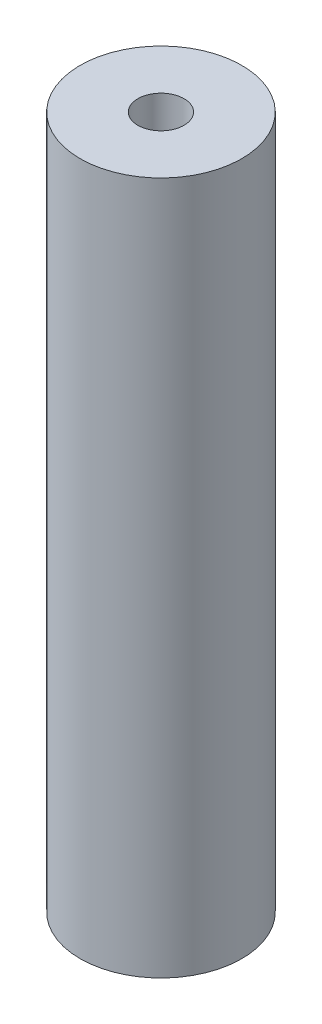
ISO-10303-21;
HEADER;
FILE_DESCRIPTION(('STEP AP214'),'2;1');
FILE_NAME('part.step','',(''),(''),'','','');
FILE_SCHEMA(('AUTOMOTIVE_DESIGN { 1 0 10303 214 1 1 1 1 }'));
ENDSEC;
DATA;
#1=APPLICATION_CONTEXT('core data for automotive mechanical design processes');
#2=APPLICATION_PROTOCOL_DEFINITION('international standard','automotive_design',2000,#1);
#3=PRODUCT_CONTEXT('',#1,'mechanical');
#4=PRODUCT('Part','Part','',(#3));
#5=PRODUCT_RELATED_PRODUCT_CATEGORY('part','',(#4));
#6=PRODUCT_DEFINITION_FORMATION('','',#4);
#7=PRODUCT_DEFINITION_CONTEXT('part definition',#1,'design');
#8=PRODUCT_DEFINITION('design','',#6,#7);
#9=PRODUCT_DEFINITION_SHAPE('','',#8);
#10=(LENGTH_UNIT() NAMED_UNIT(*) SI_UNIT(.MILLI.,.METRE.));
#11=(NAMED_UNIT(*) PLANE_ANGLE_UNIT() SI_UNIT($,.RADIAN.));
#12=(NAMED_UNIT(*) SI_UNIT($,.STERADIAN.) SOLID_ANGLE_UNIT());
#13=UNCERTAINTY_MEASURE_WITH_UNIT(LENGTH_MEASURE(1.E-05),#10,'distance_accuracy_value','');
#14=(GEOMETRIC_REPRESENTATION_CONTEXT(3) GLOBAL_UNCERTAINTY_ASSIGNED_CONTEXT((#13)) GLOBAL_UNIT_ASSIGNED_CONTEXT((#10,
#11,#12)) REPRESENTATION_CONTEXT('',''));
#15=CARTESIAN_POINT('',(0.,0.,0.));
#16=DIRECTION('',(0.,0.,1.));
#17=DIRECTION('',(1.,0.,0.));
#18=AXIS2_PLACEMENT_3D('',#15,#16,#17);
#19=CARTESIAN_POINT('',(0.,75.,0.));
#20=DIRECTION('',(0.,-1.,0.));
#21=DIRECTION('',(0.,0.,-1.));
#22=AXIS2_PLACEMENT_3D('',#19,#20,#21);
#23=CYLINDRICAL_SURFACE('',#22,8.75);
#24=CARTESIAN_POINT('',(0.,75.,0.));
#25=DIRECTION('',(0.,1.,0.));
#26=DIRECTION('',(0.,0.,1.));
#27=AXIS2_PLACEMENT_3D('',#24,#25,#26);
#28=CIRCLE('',#27,8.75);
#29=CARTESIAN_POINT('',(0.,75.,8.75));
#30=VERTEX_POINT('',#29);
#31=EDGE_CURVE('E10',#30,#30,#28,.T.);
#32=ORIENTED_EDGE('',*,*,#31,.F.);
#33=EDGE_LOOP('',(#32));
#34=FACE_BOUND('',#33,.T.);
#35=CARTESIAN_POINT('',(0.,0.,0.));
#36=DIRECTION('',(0.,1.,0.));
#37=DIRECTION('',(0.,0.,1.));
#38=AXIS2_PLACEMENT_3D('',#35,#36,#37);
#39=CIRCLE('',#38,8.75);
#40=CARTESIAN_POINT('',(0.,0.,8.75));
#41=VERTEX_POINT('',#40);
#42=EDGE_CURVE('E33',#41,#41,#39,.T.);
#43=ORIENTED_EDGE('',*,*,#42,.T.);
#44=EDGE_LOOP('',(#43));
#45=FACE_BOUND('',#44,.T.);
#46=ADVANCED_FACE('F30',(#34,#45),#23,.T.);
#47=CARTESIAN_POINT('',(0.,75.,0.));
#48=DIRECTION('',(0.,1.,0.));
#49=DIRECTION('',(0.,0.,1.));
#50=AXIS2_PLACEMENT_3D('',#47,#48,#49);
#51=PLANE('',#50);
#52=CARTESIAN_POINT('',(0.,75.,0.));
#53=DIRECTION('',(0.,1.,0.));
#54=DIRECTION('',(0.,0.,1.));
#55=AXIS2_PLACEMENT_3D('',#52,#53,#54);
#56=CIRCLE('',#55,2.5);
#57=CARTESIAN_POINT('',(0.,75.,2.5));
#58=VERTEX_POINT('',#57);
#59=EDGE_CURVE('E40',#58,#58,#56,.F.);
#60=ORIENTED_EDGE('',*,*,#59,.T.);
#61=EDGE_LOOP('',(#60));
#62=FACE_BOUND('',#61,.T.);
#63=ORIENTED_EDGE('',*,*,#31,.T.);
#64=EDGE_LOOP('',(#63));
#65=FACE_BOUND('',#64,.T.);
#66=ADVANCED_FACE('F58',(#62,#65),#51,.T.);
#67=CARTESIAN_POINT('',(0.,0.,0.));
#68=DIRECTION('',(0.,1.,0.));
#69=DIRECTION('',(0.,0.,1.));
#70=AXIS2_PLACEMENT_3D('',#67,#68,#69);
#71=PLANE('',#70);
#72=CARTESIAN_POINT('',(0.,0.,0.));
#73=DIRECTION('',(0.,1.,0.));
#74=DIRECTION('',(0.,0.,1.));
#75=AXIS2_PLACEMENT_3D('',#72,#73,#74);
#76=CIRCLE('',#75,2.5);
#77=CARTESIAN_POINT('',(0.,0.,2.5));
#78=VERTEX_POINT('',#77);
#79=EDGE_CURVE('E44',#78,#78,#76,.T.);
#80=ORIENTED_EDGE('',*,*,#79,.T.);
#81=EDGE_LOOP('',(#80));
#82=FACE_BOUND('',#81,.T.);
#83=ORIENTED_EDGE('',*,*,#42,.F.);
#84=EDGE_LOOP('',(#83));
#85=FACE_BOUND('',#84,.T.);
#86=ADVANCED_FACE('F48',(#82,#85),#71,.F.);
#87=CARTESIAN_POINT('',(0.,131.,0.));
#88=DIRECTION('',(0.,-1.,0.));
#89=DIRECTION('',(0.,0.,-1.));
#90=AXIS2_PLACEMENT_3D('',#87,#88,#89);
#91=CYLINDRICAL_SURFACE('',#90,2.5);
#92=ORIENTED_EDGE('',*,*,#59,.F.);
#93=EDGE_LOOP('',(#92));
#94=FACE_BOUND('',#93,.T.);
#95=ORIENTED_EDGE('',*,*,#79,.F.);
#96=EDGE_LOOP('',(#95));
#97=FACE_BOUND('',#96,.T.);
#98=ADVANCED_FACE('F51',(#94,#97),#91,.F.);
#99=CLOSED_SHELL('',(#46,#66,#86,#98));
#100=MANIFOLD_SOLID_BREP('B2',#99);
#101=ADVANCED_BREP_SHAPE_REPRESENTATION('',(#18,#100),#14);
#102=SHAPE_DEFINITION_REPRESENTATION(#9,#101);
ENDSEC;
END-ISO-10303-21;
